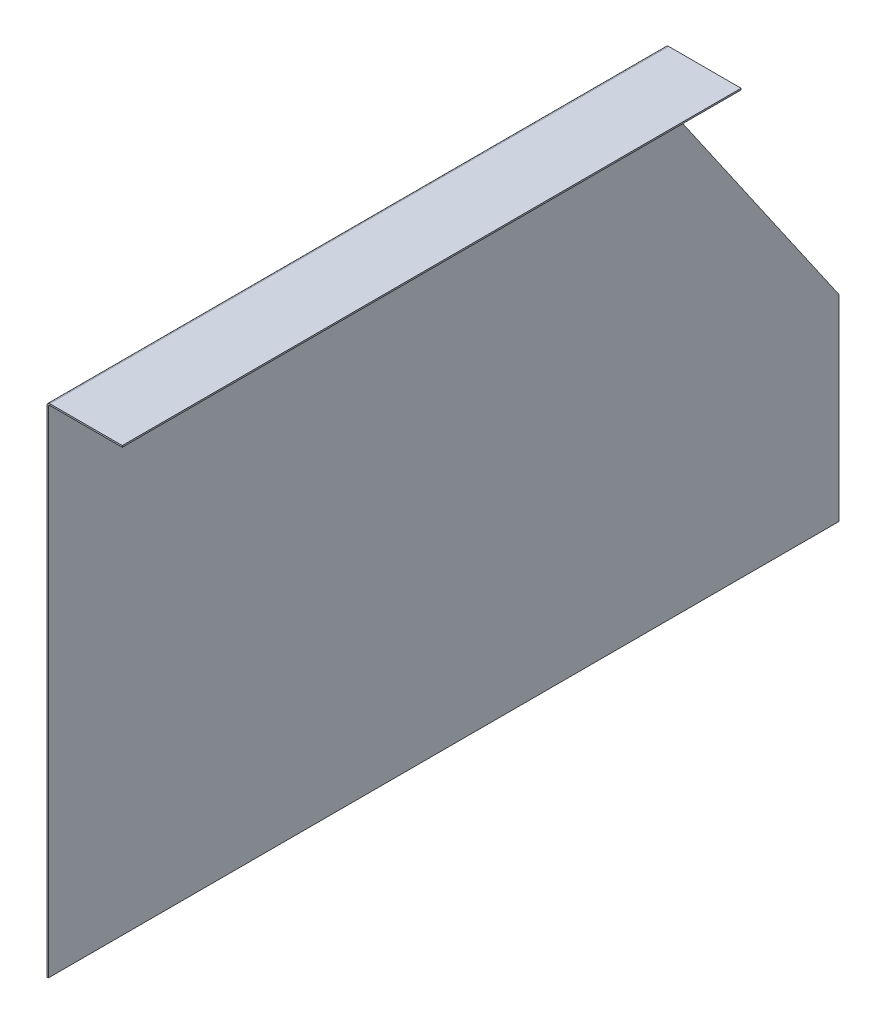
ISO-10303-21;
HEADER;
FILE_DESCRIPTION(('STEP AP214'),'2;1');
FILE_NAME('part.step','',(''),(''),'','','');
FILE_SCHEMA(('AUTOMOTIVE_DESIGN { 1 0 10303 214 1 1 1 1 }'));
ENDSEC;
DATA;
#1=APPLICATION_CONTEXT('core data for automotive mechanical design processes');
#2=APPLICATION_PROTOCOL_DEFINITION('international standard','automotive_design',2000,#1);
#3=PRODUCT_CONTEXT('',#1,'mechanical');
#4=PRODUCT('Part','Part','',(#3));
#5=PRODUCT_RELATED_PRODUCT_CATEGORY('part','',(#4));
#6=PRODUCT_DEFINITION_FORMATION('','',#4);
#7=PRODUCT_DEFINITION_CONTEXT('part definition',#1,'design');
#8=PRODUCT_DEFINITION('design','',#6,#7);
#9=PRODUCT_DEFINITION_SHAPE('','',#8);
#10=(LENGTH_UNIT() NAMED_UNIT(*) SI_UNIT(.MILLI.,.METRE.));
#11=(NAMED_UNIT(*) PLANE_ANGLE_UNIT() SI_UNIT($,.RADIAN.));
#12=(NAMED_UNIT(*) SI_UNIT($,.STERADIAN.) SOLID_ANGLE_UNIT());
#13=UNCERTAINTY_MEASURE_WITH_UNIT(LENGTH_MEASURE(1.E-05),#10,'distance_accuracy_value','');
#14=(GEOMETRIC_REPRESENTATION_CONTEXT(3) GLOBAL_UNCERTAINTY_ASSIGNED_CONTEXT((#13)) GLOBAL_UNIT_ASSIGNED_CONTEXT((#10,
#11,#12)) REPRESENTATION_CONTEXT('',''));
#15=CARTESIAN_POINT('',(0.,0.,0.));
#16=DIRECTION('',(0.,0.,1.));
#17=DIRECTION('',(1.,0.,0.));
#18=AXIS2_PLACEMENT_3D('',#15,#16,#17);
#19=CARTESIAN_POINT('',(1.,-165.,262.));
#20=DIRECTION('',(0.,0.,-1.));
#21=DIRECTION('',(-1.,0.,0.));
#22=AXIS2_PLACEMENT_3D('',#19,#20,#21);
#23=PLANE('',#22);
#24=DIRECTION('',(-1.,0.,0.));
#25=VECTOR('',#24,1.);
#26=CARTESIAN_POINT('',(1.,163.,262.));
#27=LINE('',#26,#25);
#28=CARTESIAN_POINT('',(1.,163.,262.));
#29=VERTEX_POINT('',#28);
#30=CARTESIAN_POINT('',(0.,163.,262.));
#31=VERTEX_POINT('',#30);
#32=EDGE_CURVE('E196',#29,#31,#27,.T.);
#33=ORIENTED_EDGE('',*,*,#32,.T.);
#34=DIRECTION('',(0.,-1.,0.));
#35=VECTOR('',#34,1.);
#36=CARTESIAN_POINT('',(0.,-165.,262.));
#37=LINE('',#36,#35);
#38=CARTESIAN_POINT('',(0.,-165.,262.));
#39=VERTEX_POINT('',#38);
#40=EDGE_CURVE('E205',#31,#39,#37,.T.);
#41=ORIENTED_EDGE('',*,*,#40,.T.);
#42=DIRECTION('',(-1.,0.,0.));
#43=VECTOR('',#42,1.);
#44=CARTESIAN_POINT('',(1.,-165.,262.));
#45=LINE('',#44,#43);
#46=CARTESIAN_POINT('',(1.,-165.,262.));
#47=VERTEX_POINT('',#46);
#48=EDGE_CURVE('E13',#47,#39,#45,.T.);
#49=ORIENTED_EDGE('',*,*,#48,.F.);
#50=DIRECTION('',(0.,-1.,0.));
#51=VECTOR('',#50,1.);
#52=CARTESIAN_POINT('',(1.,-165.,262.));
#53=LINE('',#52,#51);
#54=EDGE_CURVE('E108',#29,#47,#53,.T.);
#55=ORIENTED_EDGE('',*,*,#54,.F.);
#56=EDGE_LOOP('',(#33,#41,#49,#55));
#57=FACE_BOUND('',#56,.T.);
#58=ADVANCED_FACE('F57',(#57),#23,.F.);
#59=CARTESIAN_POINT('',(1.,130.,-148.));
#60=DIRECTION('',(0.,0.,1.));
#61=DIRECTION('',(1.,0.,0.));
#62=AXIS2_PLACEMENT_3D('',#59,#60,#61);
#63=PLANE('',#62);
#64=DIRECTION('',(-1.,0.,0.));
#65=VECTOR('',#64,1.);
#66=CARTESIAN_POINT('',(1.,163.,-148.));
#67=LINE('',#66,#65);
#68=CARTESIAN_POINT('',(1.,163.,-148.));
#69=VERTEX_POINT('',#68);
#70=CARTESIAN_POINT('',(0.,163.,-148.));
#71=VERTEX_POINT('',#70);
#72=EDGE_CURVE('E203',#69,#71,#67,.T.);
#73=ORIENTED_EDGE('',*,*,#72,.F.);
#74=DIRECTION('',(0.,1.,0.));
#75=VECTOR('',#74,1.);
#76=CARTESIAN_POINT('',(1.,130.,-148.));
#77=LINE('',#76,#75);
#78=CARTESIAN_POINT('',(1.,130.,-148.));
#79=VERTEX_POINT('',#78);
#80=EDGE_CURVE('E214',#79,#69,#77,.T.);
#81=ORIENTED_EDGE('',*,*,#80,.F.);
#82=DIRECTION('',(-1.,0.,0.));
#83=VECTOR('',#82,1.);
#84=CARTESIAN_POINT('',(1.,130.,-148.));
#85=LINE('',#84,#83);
#86=CARTESIAN_POINT('',(0.,130.,-148.));
#87=VERTEX_POINT('',#86);
#88=EDGE_CURVE('E216',#79,#87,#85,.T.);
#89=ORIENTED_EDGE('',*,*,#88,.T.);
#90=DIRECTION('',(0.,1.,0.));
#91=VECTOR('',#90,1.);
#92=CARTESIAN_POINT('',(0.,130.,-148.));
#93=LINE('',#92,#91);
#94=EDGE_CURVE('E209',#87,#71,#93,.T.);
#95=ORIENTED_EDGE('',*,*,#94,.T.);
#96=EDGE_LOOP('',(#73,#81,#89,#95));
#97=FACE_BOUND('',#96,.T.);
#98=ADVANCED_FACE('F242',(#97),#63,.F.);
#99=CARTESIAN_POINT('',(1.,0.,0.));
#100=DIRECTION('',(-1.,0.,0.));
#101=DIRECTION('',(0.,0.,1.));
#102=AXIS2_PLACEMENT_3D('',#99,#100,#101);
#103=PLANE('',#102);
#104=DIRECTION('',(0.,0.,1.));
#105=VECTOR('',#104,1.);
#106=CARTESIAN_POINT('',(1.,163.,262.));
#107=LINE('',#106,#105);
#108=EDGE_CURVE('E200',#29,#69,#107,.F.);
#109=ORIENTED_EDGE('',*,*,#108,.F.);
#110=ORIENTED_EDGE('',*,*,#54,.T.);
#111=DIRECTION('',(0.,0.,-1.));
#112=VECTOR('',#111,1.);
#113=CARTESIAN_POINT('',(1.,-165.,262.));
#114=LINE('',#113,#112);
#115=CARTESIAN_POINT('',(1.,-165.,-262.));
#116=VERTEX_POINT('',#115);
#117=EDGE_CURVE('E208',#47,#116,#114,.T.);
#118=ORIENTED_EDGE('',*,*,#117,.T.);
#119=DIRECTION('',(0.,1.,0.));
#120=VECTOR('',#119,1.);
#121=CARTESIAN_POINT('',(1.,-165.,-262.));
#122=LINE('',#121,#120);
#123=CARTESIAN_POINT('',(1.,-35.,-262.));
#124=VERTEX_POINT('',#123);
#125=EDGE_CURVE('E211',#116,#124,#122,.T.);
#126=ORIENTED_EDGE('',*,*,#125,.T.);
#127=DIRECTION('',(0.,0.822730338093269,0.568431869955349));
#128=VECTOR('',#127,1.);
#129=CARTESIAN_POINT('',(1.,-35.,-262.));
#130=LINE('',#129,#128);
#131=EDGE_CURVE('E80',#124,#79,#130,.T.);
#132=ORIENTED_EDGE('',*,*,#131,.T.);
#133=ORIENTED_EDGE('',*,*,#80,.T.);
#134=EDGE_LOOP('',(#109,#110,#118,#126,#132,#133));
#135=FACE_BOUND('',#134,.T.);
#136=ADVANCED_FACE('F262',(#135),#103,.F.);
#137=CARTESIAN_POINT('',(0.,0.,0.));
#138=DIRECTION('',(-1.,0.,0.));
#139=DIRECTION('',(0.,0.,1.));
#140=AXIS2_PLACEMENT_3D('',#137,#138,#139);
#141=PLANE('',#140);
#142=ORIENTED_EDGE('',*,*,#40,.F.);
#143=DIRECTION('',(0.,0.,1.));
#144=VECTOR('',#143,1.);
#145=CARTESIAN_POINT('',(0.,163.,262.));
#146=LINE('',#145,#144);
#147=EDGE_CURVE('E147',#31,#71,#146,.F.);
#148=ORIENTED_EDGE('',*,*,#147,.T.);
#149=ORIENTED_EDGE('',*,*,#94,.F.);
#150=DIRECTION('',(0.,0.822730338093269,0.568431869955349));
#151=VECTOR('',#150,1.);
#152=CARTESIAN_POINT('',(0.,-35.,-262.));
#153=LINE('',#152,#151);
#154=CARTESIAN_POINT('',(0.,-35.,-262.));
#155=VERTEX_POINT('',#154);
#156=EDGE_CURVE('E101',#155,#87,#153,.T.);
#157=ORIENTED_EDGE('',*,*,#156,.F.);
#158=DIRECTION('',(0.,1.,0.));
#159=VECTOR('',#158,1.);
#160=CARTESIAN_POINT('',(0.,-165.,-262.));
#161=LINE('',#160,#159);
#162=CARTESIAN_POINT('',(0.,-165.,-262.));
#163=VERTEX_POINT('',#162);
#164=EDGE_CURVE('E220',#163,#155,#161,.T.);
#165=ORIENTED_EDGE('',*,*,#164,.F.);
#166=DIRECTION('',(0.,0.,-1.));
#167=VECTOR('',#166,1.);
#168=CARTESIAN_POINT('',(0.,-165.,262.));
#169=LINE('',#168,#167);
#170=EDGE_CURVE('E218',#39,#163,#169,.T.);
#171=ORIENTED_EDGE('',*,*,#170,.F.);
#172=EDGE_LOOP('',(#142,#148,#149,#157,#165,#171));
#173=FACE_BOUND('',#172,.T.);
#174=ADVANCED_FACE('F238',(#173),#141,.T.);
#175=CARTESIAN_POINT('',(1.,-165.,262.));
#176=DIRECTION('',(0.,1.,0.));
#177=DIRECTION('',(0.,0.,1.));
#178=AXIS2_PLACEMENT_3D('',#175,#176,#177);
#179=PLANE('',#178);
#180=ORIENTED_EDGE('',*,*,#170,.T.);
#181=DIRECTION('',(-1.,0.,0.));
#182=VECTOR('',#181,1.);
#183=CARTESIAN_POINT('',(1.,-165.,-262.));
#184=LINE('',#183,#182);
#185=EDGE_CURVE('E64',#116,#163,#184,.T.);
#186=ORIENTED_EDGE('',*,*,#185,.F.);
#187=ORIENTED_EDGE('',*,*,#117,.F.);
#188=ORIENTED_EDGE('',*,*,#48,.T.);
#189=EDGE_LOOP('',(#180,#186,#187,#188));
#190=FACE_BOUND('',#189,.T.);
#191=ADVANCED_FACE('F254',(#190),#179,.F.);
#192=CARTESIAN_POINT('',(1.,-165.,-262.));
#193=DIRECTION('',(0.,0.,1.));
#194=DIRECTION('',(1.,0.,0.));
#195=AXIS2_PLACEMENT_3D('',#192,#193,#194);
#196=PLANE('',#195);
#197=ORIENTED_EDGE('',*,*,#164,.T.);
#198=DIRECTION('',(-1.,0.,0.));
#199=VECTOR('',#198,1.);
#200=CARTESIAN_POINT('',(1.,-35.,-262.));
#201=LINE('',#200,#199);
#202=EDGE_CURVE('E226',#124,#155,#201,.T.);
#203=ORIENTED_EDGE('',*,*,#202,.F.);
#204=ORIENTED_EDGE('',*,*,#125,.F.);
#205=ORIENTED_EDGE('',*,*,#185,.T.);
#206=EDGE_LOOP('',(#197,#203,#204,#205));
#207=FACE_BOUND('',#206,.T.);
#208=ADVANCED_FACE('F232',(#207),#196,.F.);
#209=CARTESIAN_POINT('',(1.,-35.,-262.));
#210=DIRECTION('',(0.,-0.56843186995535,0.822730338093269));
#211=DIRECTION('',(0.,-0.822730338093269,-0.56843186995535));
#212=AXIS2_PLACEMENT_3D('',#209,#210,#211);
#213=PLANE('',#212);
#214=ORIENTED_EDGE('',*,*,#156,.T.);
#215=ORIENTED_EDGE('',*,*,#88,.F.);
#216=ORIENTED_EDGE('',*,*,#131,.F.);
#217=ORIENTED_EDGE('',*,*,#202,.T.);
#218=EDGE_LOOP('',(#214,#215,#216,#217));
#219=FACE_BOUND('',#218,.T.);
#220=ADVANCED_FACE('F244',(#219),#213,.F.);
#221=CARTESIAN_POINT('',(2.00000000000001,163.,-148.));
#222=DIRECTION('',(0.,0.,-1.));
#223=DIRECTION('',(-1.,0.,0.));
#224=AXIS2_PLACEMENT_3D('',#221,#222,#223);
#225=PLANE('',#224);
#226=DIRECTION('',(0.,1.,0.));
#227=VECTOR('',#226,1.);
#228=CARTESIAN_POINT('',(2.,165.,-148.));
#229=LINE('',#228,#227);
#230=CARTESIAN_POINT('',(2.,164.,-148.));
#231=VERTEX_POINT('',#230);
#232=CARTESIAN_POINT('',(2.,165.,-148.));
#233=VERTEX_POINT('',#232);
#234=EDGE_CURVE('E192',#231,#233,#229,.T.);
#235=ORIENTED_EDGE('',*,*,#234,.F.);
#236=CARTESIAN_POINT('',(2.00000000000001,163.,-148.));
#237=DIRECTION('',(0.,0.,1.));
#238=DIRECTION('',(1.,0.,0.));
#239=AXIS2_PLACEMENT_3D('',#236,#237,#238);
#240=CIRCLE('',#239,1.);
#241=EDGE_CURVE('E150',#69,#231,#240,.F.);
#242=ORIENTED_EDGE('',*,*,#241,.F.);
#243=ORIENTED_EDGE('',*,*,#72,.T.);
#244=CARTESIAN_POINT('',(2.00000000000001,163.,-148.));
#245=DIRECTION('',(0.,0.,1.));
#246=DIRECTION('',(1.,0.,0.));
#247=AXIS2_PLACEMENT_3D('',#244,#245,#246);
#248=CIRCLE('',#247,2.);
#249=EDGE_CURVE('E71',#71,#233,#248,.F.);
#250=ORIENTED_EDGE('',*,*,#249,.T.);
#251=EDGE_LOOP('',(#235,#242,#243,#250));
#252=FACE_BOUND('',#251,.T.);
#253=ADVANCED_FACE('F246',(#252),#225,.T.);
#254=CARTESIAN_POINT('',(2.00000000000001,163.,262.));
#255=DIRECTION('',(0.,0.,-1.));
#256=DIRECTION('',(-1.,0.,0.));
#257=AXIS2_PLACEMENT_3D('',#254,#255,#256);
#258=PLANE('',#257);
#259=CARTESIAN_POINT('',(2.00000000000001,163.,262.));
#260=DIRECTION('',(0.,0.,1.));
#261=DIRECTION('',(1.,0.,0.));
#262=AXIS2_PLACEMENT_3D('',#259,#260,#261);
#263=CIRCLE('',#262,1.);
#264=CARTESIAN_POINT('',(2.,164.,262.));
#265=VERTEX_POINT('',#264);
#266=EDGE_CURVE('E157',#265,#29,#263,.T.);
#267=ORIENTED_EDGE('',*,*,#266,.F.);
#268=DIRECTION('',(0.,1.,0.));
#269=VECTOR('',#268,1.);
#270=CARTESIAN_POINT('',(2.,164.,262.));
#271=LINE('',#270,#269);
#272=CARTESIAN_POINT('',(2.,165.,262.));
#273=VERTEX_POINT('',#272);
#274=EDGE_CURVE('E154',#265,#273,#271,.T.);
#275=ORIENTED_EDGE('',*,*,#274,.T.);
#276=CARTESIAN_POINT('',(2.00000000000001,163.,262.));
#277=DIRECTION('',(0.,0.,1.));
#278=DIRECTION('',(1.,0.,0.));
#279=AXIS2_PLACEMENT_3D('',#276,#277,#278);
#280=CIRCLE('',#279,2.);
#281=EDGE_CURVE('E141',#273,#31,#280,.T.);
#282=ORIENTED_EDGE('',*,*,#281,.T.);
#283=ORIENTED_EDGE('',*,*,#32,.F.);
#284=EDGE_LOOP('',(#267,#275,#282,#283));
#285=FACE_BOUND('',#284,.T.);
#286=ADVANCED_FACE('F155',(#285),#258,.F.);
#287=CARTESIAN_POINT('',(2.00000000000001,163.,262.));
#288=DIRECTION('',(0.,0.,1.));
#289=DIRECTION('',(0.,1.,0.));
#290=AXIS2_PLACEMENT_3D('',#287,#288,#289);
#291=CYLINDRICAL_SURFACE('',#290,2.);
#292=ORIENTED_EDGE('',*,*,#147,.F.);
#293=ORIENTED_EDGE('',*,*,#281,.F.);
#294=DIRECTION('',(0.,0.,1.));
#295=VECTOR('',#294,1.);
#296=CARTESIAN_POINT('',(2.,165.,0.));
#297=LINE('',#296,#295);
#298=EDGE_CURVE('E145',#233,#273,#297,.T.);
#299=ORIENTED_EDGE('',*,*,#298,.F.);
#300=ORIENTED_EDGE('',*,*,#249,.F.);
#301=EDGE_LOOP('',(#292,#293,#299,#300));
#302=FACE_BOUND('',#301,.T.);
#303=ADVANCED_FACE('F143',(#302),#291,.T.);
#304=CARTESIAN_POINT('',(2.00000000000001,163.,262.));
#305=DIRECTION('',(0.,0.,1.));
#306=DIRECTION('',(0.,1.,0.));
#307=AXIS2_PLACEMENT_3D('',#304,#305,#306);
#308=CYLINDRICAL_SURFACE('',#307,1.);
#309=ORIENTED_EDGE('',*,*,#108,.T.);
#310=ORIENTED_EDGE('',*,*,#241,.T.);
#311=DIRECTION('',(0.,0.,-1.));
#312=VECTOR('',#311,1.);
#313=CARTESIAN_POINT('',(2.,164.,-148.));
#314=LINE('',#313,#312);
#315=EDGE_CURVE('E162',#231,#265,#314,.F.);
#316=ORIENTED_EDGE('',*,*,#315,.T.);
#317=ORIENTED_EDGE('',*,*,#266,.T.);
#318=EDGE_LOOP('',(#309,#310,#316,#317));
#319=FACE_BOUND('',#318,.T.);
#320=ADVANCED_FACE('F265',(#319),#308,.F.);
#321=CARTESIAN_POINT('',(0.999999999999997,165.,262.));
#322=DIRECTION('',(0.,0.,1.));
#323=DIRECTION('',(1.,0.,0.));
#324=AXIS2_PLACEMENT_3D('',#321,#322,#323);
#325=PLANE('',#324);
#326=DIRECTION('',(-1.,0.,0.));
#327=VECTOR('',#326,1.);
#328=CARTESIAN_POINT('',(0.999999999999997,165.,262.));
#329=LINE('',#328,#327);
#330=CARTESIAN_POINT('',(50.,165.,262.));
#331=VERTEX_POINT('',#330);
#332=EDGE_CURVE('E169',#331,#273,#329,.T.);
#333=ORIENTED_EDGE('',*,*,#332,.T.);
#334=ORIENTED_EDGE('',*,*,#274,.F.);
#335=DIRECTION('',(1.,0.,0.));
#336=VECTOR('',#335,1.);
#337=CARTESIAN_POINT('',(-1.45122009647431E-12,164.,262.));
#338=LINE('',#337,#336);
#339=CARTESIAN_POINT('',(50.,164.,262.));
#340=VERTEX_POINT('',#339);
#341=EDGE_CURVE('E185',#340,#265,#338,.F.);
#342=ORIENTED_EDGE('',*,*,#341,.F.);
#343=DIRECTION('',(0.,-1.,0.));
#344=VECTOR('',#343,1.);
#345=CARTESIAN_POINT('',(50.,165.,262.));
#346=LINE('',#345,#344);
#347=EDGE_CURVE('E174',#331,#340,#346,.T.);
#348=ORIENTED_EDGE('',*,*,#347,.F.);
#349=EDGE_LOOP('',(#333,#334,#342,#348));
#350=FACE_BOUND('',#349,.T.);
#351=ADVANCED_FACE('F173',(#350),#325,.T.);
#352=CARTESIAN_POINT('',(50.,165.,-148.));
#353=DIRECTION('',(0.,0.,-1.));
#354=DIRECTION('',(-1.,0.,0.));
#355=AXIS2_PLACEMENT_3D('',#352,#353,#354);
#356=PLANE('',#355);
#357=DIRECTION('',(-1.,0.,0.));
#358=VECTOR('',#357,1.);
#359=CARTESIAN_POINT('',(0.,164.,-148.));
#360=LINE('',#359,#358);
#361=CARTESIAN_POINT('',(50.,164.,-148.));
#362=VERTEX_POINT('',#361);
#363=EDGE_CURVE('E171',#231,#362,#360,.F.);
#364=ORIENTED_EDGE('',*,*,#363,.F.);
#365=ORIENTED_EDGE('',*,*,#234,.T.);
#366=DIRECTION('',(1.,0.,0.));
#367=VECTOR('',#366,1.);
#368=CARTESIAN_POINT('',(50.,165.,-148.));
#369=LINE('',#368,#367);
#370=CARTESIAN_POINT('',(50.,165.,-148.));
#371=VERTEX_POINT('',#370);
#372=EDGE_CURVE('E170',#233,#371,#369,.T.);
#373=ORIENTED_EDGE('',*,*,#372,.T.);
#374=DIRECTION('',(0.,-1.,0.));
#375=VECTOR('',#374,1.);
#376=CARTESIAN_POINT('',(50.,165.,-148.));
#377=LINE('',#376,#375);
#378=EDGE_CURVE('E176',#371,#362,#377,.T.);
#379=ORIENTED_EDGE('',*,*,#378,.T.);
#380=EDGE_LOOP('',(#364,#365,#373,#379));
#381=FACE_BOUND('',#380,.T.);
#382=ADVANCED_FACE('F281',(#381),#356,.T.);
#383=CARTESIAN_POINT('',(-5.64267396838285E-13,165.,0.));
#384=DIRECTION('',(0.,1.,0.));
#385=DIRECTION('',(-1.,0.,0.));
#386=AXIS2_PLACEMENT_3D('',#383,#384,#385);
#387=PLANE('',#386);
#388=ORIENTED_EDGE('',*,*,#372,.F.);
#389=ORIENTED_EDGE('',*,*,#298,.T.);
#390=ORIENTED_EDGE('',*,*,#332,.F.);
#391=DIRECTION('',(0.,0.,1.));
#392=VECTOR('',#391,1.);
#393=CARTESIAN_POINT('',(50.,165.,262.));
#394=LINE('',#393,#392);
#395=EDGE_CURVE('E177',#371,#331,#394,.T.);
#396=ORIENTED_EDGE('',*,*,#395,.F.);
#397=EDGE_LOOP('',(#388,#389,#390,#396));
#398=FACE_BOUND('',#397,.T.);
#399=ADVANCED_FACE('F167',(#398),#387,.T.);
#400=CARTESIAN_POINT('',(-5.60775915499441E-13,164.,0.));
#401=DIRECTION('',(0.,1.,0.));
#402=DIRECTION('',(-1.,0.,0.));
#403=AXIS2_PLACEMENT_3D('',#400,#401,#402);
#404=PLANE('',#403);
#405=ORIENTED_EDGE('',*,*,#315,.F.);
#406=ORIENTED_EDGE('',*,*,#363,.T.);
#407=DIRECTION('',(0.,0.,-1.));
#408=VECTOR('',#407,1.);
#409=CARTESIAN_POINT('',(50.,164.,0.));
#410=LINE('',#409,#408);
#411=EDGE_CURVE('E187',#362,#340,#410,.F.);
#412=ORIENTED_EDGE('',*,*,#411,.T.);
#413=ORIENTED_EDGE('',*,*,#341,.T.);
#414=EDGE_LOOP('',(#405,#406,#412,#413));
#415=FACE_BOUND('',#414,.T.);
#416=ADVANCED_FACE('F288',(#415),#404,.F.);
#417=CARTESIAN_POINT('',(50.,165.,262.));
#418=DIRECTION('',(1.,0.,0.));
#419=DIRECTION('',(0.,1.,0.));
#420=AXIS2_PLACEMENT_3D('',#417,#418,#419);
#421=PLANE('',#420);
#422=ORIENTED_EDGE('',*,*,#411,.F.);
#423=ORIENTED_EDGE('',*,*,#378,.F.);
#424=ORIENTED_EDGE('',*,*,#395,.T.);
#425=ORIENTED_EDGE('',*,*,#347,.T.);
#426=EDGE_LOOP('',(#422,#423,#424,#425));
#427=FACE_BOUND('',#426,.T.);
#428=ADVANCED_FACE('F285',(#427),#421,.T.);
#429=CLOSED_SHELL('',(#58,#98,#136,#174,#191,#208,#220,#253,#286,#303,#320,#351,#382,#399,#416,#428));
#430=MANIFOLD_SOLID_BREP('B2',#429);
#431=ADVANCED_BREP_SHAPE_REPRESENTATION('',(#18,#430),#14);
#432=SHAPE_DEFINITION_REPRESENTATION(#9,#431);
ENDSEC;
END-ISO-10303-21;
